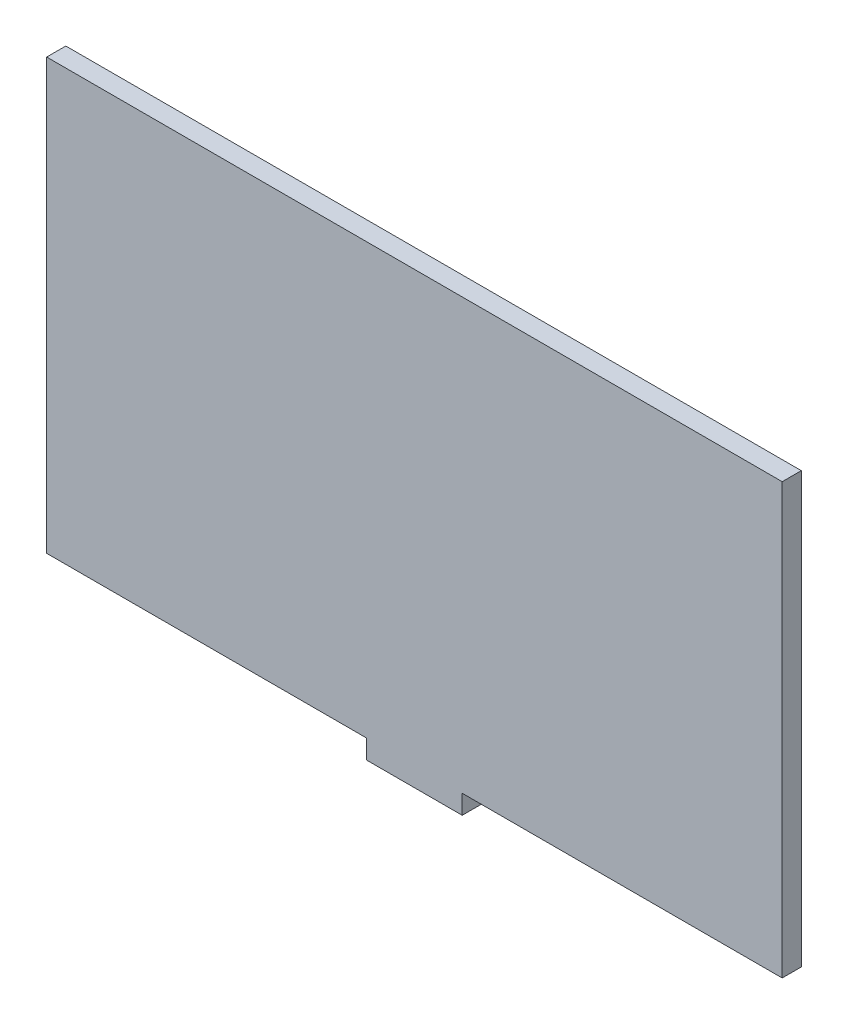
ISO-10303-21;
HEADER;
FILE_DESCRIPTION(('STEP AP214'),'2;1');
FILE_NAME('part.step','',(''),(''),'','','');
FILE_SCHEMA(('AUTOMOTIVE_DESIGN { 1 0 10303 214 1 1 1 1 }'));
ENDSEC;
DATA;
#1=APPLICATION_CONTEXT('core data for automotive mechanical design processes');
#2=APPLICATION_PROTOCOL_DEFINITION('international standard','automotive_design',2000,#1);
#3=PRODUCT_CONTEXT('',#1,'mechanical');
#4=PRODUCT('Part','Part','',(#3));
#5=PRODUCT_RELATED_PRODUCT_CATEGORY('part','',(#4));
#6=PRODUCT_DEFINITION_FORMATION('','',#4);
#7=PRODUCT_DEFINITION_CONTEXT('part definition',#1,'design');
#8=PRODUCT_DEFINITION('design','',#6,#7);
#9=PRODUCT_DEFINITION_SHAPE('','',#8);
#10=(LENGTH_UNIT() NAMED_UNIT(*) SI_UNIT(.MILLI.,.METRE.));
#11=(NAMED_UNIT(*) PLANE_ANGLE_UNIT() SI_UNIT($,.RADIAN.));
#12=(NAMED_UNIT(*) SI_UNIT($,.STERADIAN.) SOLID_ANGLE_UNIT());
#13=UNCERTAINTY_MEASURE_WITH_UNIT(LENGTH_MEASURE(1.E-05),#10,'distance_accuracy_value','');
#14=(GEOMETRIC_REPRESENTATION_CONTEXT(3) GLOBAL_UNCERTAINTY_ASSIGNED_CONTEXT((#13)) GLOBAL_UNIT_ASSIGNED_CONTEXT((#10,
#11,#12)) REPRESENTATION_CONTEXT('',''));
#15=CARTESIAN_POINT('',(0.,0.,0.));
#16=DIRECTION('',(0.,0.,1.));
#17=DIRECTION('',(1.,0.,0.));
#18=AXIS2_PLACEMENT_3D('',#15,#16,#17);
#19=CARTESIAN_POINT('',(-34.0534801136364,12.3013067045455,2.));
#20=DIRECTION('',(1.,0.,0.));
#21=DIRECTION('',(0.,0.,-1.));
#22=AXIS2_PLACEMENT_3D('',#19,#20,#21);
#23=PLANE('',#22);
#24=DIRECTION('',(0.,-1.,0.));
#25=VECTOR('',#24,1.);
#26=CARTESIAN_POINT('',(-34.0534801136364,12.3013067045455,0.));
#27=LINE('',#26,#25);
#28=CARTESIAN_POINT('',(-34.0534801136364,12.3013067045455,0.));
#29=VERTEX_POINT('',#28);
#30=CARTESIAN_POINT('',(-34.0534801136364,-32.6986932954546,0.));
#31=VERTEX_POINT('',#30);
#32=EDGE_CURVE('E135',#29,#31,#27,.T.);
#33=ORIENTED_EDGE('',*,*,#32,.T.);
#34=DIRECTION('',(0.,0.,-1.));
#35=VECTOR('',#34,1.);
#36=CARTESIAN_POINT('',(-34.0534801136364,-32.6986932954546,2.));
#37=LINE('',#36,#35);
#38=CARTESIAN_POINT('',(-34.0534801136364,-32.6986932954546,2.));
#39=VERTEX_POINT('',#38);
#40=EDGE_CURVE('E11',#39,#31,#37,.T.);
#41=ORIENTED_EDGE('',*,*,#40,.F.);
#42=DIRECTION('',(0.,-1.,0.));
#43=VECTOR('',#42,1.);
#44=CARTESIAN_POINT('',(-34.0534801136364,12.3013067045455,2.));
#45=LINE('',#44,#43);
#46=CARTESIAN_POINT('',(-34.0534801136364,12.3013067045455,2.));
#47=VERTEX_POINT('',#46);
#48=EDGE_CURVE('E149',#47,#39,#45,.T.);
#49=ORIENTED_EDGE('',*,*,#48,.F.);
#50=DIRECTION('',(0.,0.,-1.));
#51=VECTOR('',#50,1.);
#52=CARTESIAN_POINT('',(-34.0534801136364,12.3013067045455,2.));
#53=LINE('',#52,#51);
#54=EDGE_CURVE('E131',#47,#29,#53,.T.);
#55=ORIENTED_EDGE('',*,*,#54,.T.);
#56=EDGE_LOOP('',(#33,#41,#49,#55));
#57=FACE_BOUND('',#56,.T.);
#58=ADVANCED_FACE('F39',(#57),#23,.F.);
#59=CARTESIAN_POINT('',(-34.0534801136364,-32.6986932954546,2.));
#60=DIRECTION('',(0.,1.,0.));
#61=DIRECTION('',(-1.,0.,0.));
#62=AXIS2_PLACEMENT_3D('',#59,#60,#61);
#63=PLANE('',#62);
#64=DIRECTION('',(1.,0.,0.));
#65=VECTOR('',#64,1.);
#66=CARTESIAN_POINT('',(-34.0534801136364,-32.6986932954546,0.));
#67=LINE('',#66,#65);
#68=CARTESIAN_POINT('',(-0.553480113636365,-32.6986932954545,0.));
#69=VERTEX_POINT('',#68);
#70=EDGE_CURVE('E138',#31,#69,#67,.T.);
#71=ORIENTED_EDGE('',*,*,#70,.T.);
#72=DIRECTION('',(0.,0.,-1.));
#73=VECTOR('',#72,1.);
#74=CARTESIAN_POINT('',(-0.553480113636365,-32.6986932954545,2.));
#75=LINE('',#74,#73);
#76=CARTESIAN_POINT('',(-0.553480113636365,-32.6986932954545,2.));
#77=VERTEX_POINT('',#76);
#78=EDGE_CURVE('E47',#77,#69,#75,.T.);
#79=ORIENTED_EDGE('',*,*,#78,.F.);
#80=DIRECTION('',(1.,0.,0.));
#81=VECTOR('',#80,1.);
#82=CARTESIAN_POINT('',(-34.0534801136364,-32.6986932954546,2.));
#83=LINE('',#82,#81);
#84=EDGE_CURVE('E98',#39,#77,#83,.T.);
#85=ORIENTED_EDGE('',*,*,#84,.F.);
#86=ORIENTED_EDGE('',*,*,#40,.T.);
#87=EDGE_LOOP('',(#71,#79,#85,#86));
#88=FACE_BOUND('',#87,.T.);
#89=ADVANCED_FACE('F184',(#88),#63,.F.);
#90=CARTESIAN_POINT('',(-0.553480113636365,-34.6986932954545,2.));
#91=DIRECTION('',(1.,0.,0.));
#92=DIRECTION('',(0.,0.,-1.));
#93=AXIS2_PLACEMENT_3D('',#90,#91,#92);
#94=PLANE('',#93);
#95=DIRECTION('',(0.,-1.,0.));
#96=VECTOR('',#95,1.);
#97=CARTESIAN_POINT('',(-0.553480113636365,-34.6986932954545,0.));
#98=LINE('',#97,#96);
#99=CARTESIAN_POINT('',(-0.553480113636365,-34.6986932954545,0.));
#100=VERTEX_POINT('',#99);
#101=EDGE_CURVE('E140',#69,#100,#98,.T.);
#102=ORIENTED_EDGE('',*,*,#101,.T.);
#103=DIRECTION('',(0.,0.,-1.));
#104=VECTOR('',#103,1.);
#105=CARTESIAN_POINT('',(-0.553480113636365,-34.6986932954545,2.));
#106=LINE('',#105,#104);
#107=CARTESIAN_POINT('',(-0.553480113636365,-34.6986932954545,2.));
#108=VERTEX_POINT('',#107);
#109=EDGE_CURVE('E156',#108,#100,#106,.T.);
#110=ORIENTED_EDGE('',*,*,#109,.F.);
#111=DIRECTION('',(0.,-1.,0.));
#112=VECTOR('',#111,1.);
#113=CARTESIAN_POINT('',(-0.553480113636365,-34.6986932954545,2.));
#114=LINE('',#113,#112);
#115=EDGE_CURVE('E164',#77,#108,#114,.T.);
#116=ORIENTED_EDGE('',*,*,#115,.F.);
#117=ORIENTED_EDGE('',*,*,#78,.T.);
#118=EDGE_LOOP('',(#102,#110,#116,#117));
#119=FACE_BOUND('',#118,.T.);
#120=ADVANCED_FACE('F162',(#119),#94,.F.);
#121=CARTESIAN_POINT('',(-0.553480113636365,-34.6986932954545,2.));
#122=DIRECTION('',(0.,1.,0.));
#123=DIRECTION('',(0.,0.,1.));
#124=AXIS2_PLACEMENT_3D('',#121,#122,#123);
#125=PLANE('',#124);
#126=DIRECTION('',(1.,0.,0.));
#127=VECTOR('',#126,1.);
#128=CARTESIAN_POINT('',(-0.553480113636365,-34.6986932954545,0.));
#129=LINE('',#128,#127);
#130=CARTESIAN_POINT('',(9.44651988636364,-34.6986932954545,0.));
#131=VERTEX_POINT('',#130);
#132=EDGE_CURVE('E142',#100,#131,#129,.T.);
#133=ORIENTED_EDGE('',*,*,#132,.T.);
#134=DIRECTION('',(0.,0.,-1.));
#135=VECTOR('',#134,1.);
#136=CARTESIAN_POINT('',(9.44651988636364,-34.6986932954545,2.));
#137=LINE('',#136,#135);
#138=CARTESIAN_POINT('',(9.44651988636364,-34.6986932954545,2.));
#139=VERTEX_POINT('',#138);
#140=EDGE_CURVE('E153',#139,#131,#137,.T.);
#141=ORIENTED_EDGE('',*,*,#140,.F.);
#142=DIRECTION('',(1.,0.,0.));
#143=VECTOR('',#142,1.);
#144=CARTESIAN_POINT('',(-0.553480113636365,-34.6986932954545,2.));
#145=LINE('',#144,#143);
#146=EDGE_CURVE('E176',#108,#139,#145,.T.);
#147=ORIENTED_EDGE('',*,*,#146,.F.);
#148=ORIENTED_EDGE('',*,*,#109,.T.);
#149=EDGE_LOOP('',(#133,#141,#147,#148));
#150=FACE_BOUND('',#149,.T.);
#151=ADVANCED_FACE('F172',(#150),#125,.F.);
#152=CARTESIAN_POINT('',(9.44651988636364,-34.6986932954545,2.));
#153=DIRECTION('',(-1.,0.,0.));
#154=DIRECTION('',(0.,0.,1.));
#155=AXIS2_PLACEMENT_3D('',#152,#153,#154);
#156=PLANE('',#155);
#157=DIRECTION('',(0.,1.,0.));
#158=VECTOR('',#157,1.);
#159=CARTESIAN_POINT('',(9.44651988636364,-34.6986932954545,0.));
#160=LINE('',#159,#158);
#161=CARTESIAN_POINT('',(9.44651988636364,-32.6986932954545,0.));
#162=VERTEX_POINT('',#161);
#163=EDGE_CURVE('E144',#131,#162,#160,.T.);
#164=ORIENTED_EDGE('',*,*,#163,.T.);
#165=DIRECTION('',(0.,0.,-1.));
#166=VECTOR('',#165,1.);
#167=CARTESIAN_POINT('',(9.44651988636364,-32.6986932954545,2.));
#168=LINE('',#167,#166);
#169=CARTESIAN_POINT('',(9.44651988636364,-32.6986932954545,2.));
#170=VERTEX_POINT('',#169);
#171=EDGE_CURVE('E126',#170,#162,#168,.T.);
#172=ORIENTED_EDGE('',*,*,#171,.F.);
#173=DIRECTION('',(0.,1.,0.));
#174=VECTOR('',#173,1.);
#175=CARTESIAN_POINT('',(9.44651988636364,-34.6986932954545,2.));
#176=LINE('',#175,#174);
#177=EDGE_CURVE('E117',#139,#170,#176,.T.);
#178=ORIENTED_EDGE('',*,*,#177,.F.);
#179=ORIENTED_EDGE('',*,*,#140,.T.);
#180=EDGE_LOOP('',(#164,#172,#178,#179));
#181=FACE_BOUND('',#180,.T.);
#182=ADVANCED_FACE('F175',(#181),#156,.F.);
#183=CARTESIAN_POINT('',(9.44651988636364,-32.6986932954545,2.));
#184=DIRECTION('',(0.,1.,0.));
#185=DIRECTION('',(0.,0.,1.));
#186=AXIS2_PLACEMENT_3D('',#183,#184,#185);
#187=PLANE('',#186);
#188=DIRECTION('',(1.,0.,0.));
#189=VECTOR('',#188,1.);
#190=CARTESIAN_POINT('',(9.44651988636364,-32.6986932954545,0.));
#191=LINE('',#190,#189);
#192=CARTESIAN_POINT('',(42.9465198863636,-32.6986932954545,0.));
#193=VERTEX_POINT('',#192);
#194=EDGE_CURVE('E125',#162,#193,#191,.T.);
#195=ORIENTED_EDGE('',*,*,#194,.T.);
#196=DIRECTION('',(0.,0.,-1.));
#197=VECTOR('',#196,1.);
#198=CARTESIAN_POINT('',(42.9465198863636,-32.6986932954545,2.));
#199=LINE('',#198,#197);
#200=CARTESIAN_POINT('',(42.9465198863636,-32.6986932954545,2.));
#201=VERTEX_POINT('',#200);
#202=EDGE_CURVE('E122',#201,#193,#199,.T.);
#203=ORIENTED_EDGE('',*,*,#202,.F.);
#204=DIRECTION('',(1.,0.,0.));
#205=VECTOR('',#204,1.);
#206=CARTESIAN_POINT('',(9.44651988636364,-32.6986932954545,2.));
#207=LINE('',#206,#205);
#208=EDGE_CURVE('E111',#170,#201,#207,.T.);
#209=ORIENTED_EDGE('',*,*,#208,.F.);
#210=ORIENTED_EDGE('',*,*,#171,.T.);
#211=EDGE_LOOP('',(#195,#203,#209,#210));
#212=FACE_BOUND('',#211,.T.);
#213=ADVANCED_FACE('F123',(#212),#187,.F.);
#214=CARTESIAN_POINT('',(42.9465198863636,12.3013067045455,2.));
#215=DIRECTION('',(-1.,0.,0.));
#216=DIRECTION('',(0.,-1.,0.));
#217=AXIS2_PLACEMENT_3D('',#214,#215,#216);
#218=PLANE('',#217);
#219=DIRECTION('',(0.,1.,0.));
#220=VECTOR('',#219,1.);
#221=CARTESIAN_POINT('',(42.9465198863636,12.3013067045455,0.));
#222=LINE('',#221,#220);
#223=CARTESIAN_POINT('',(42.9465198863636,12.3013067045455,0.));
#224=VERTEX_POINT('',#223);
#225=EDGE_CURVE('E84',#193,#224,#222,.T.);
#226=ORIENTED_EDGE('',*,*,#225,.T.);
#227=DIRECTION('',(0.,0.,-1.));
#228=VECTOR('',#227,1.);
#229=CARTESIAN_POINT('',(42.9465198863636,12.3013067045455,2.));
#230=LINE('',#229,#228);
#231=CARTESIAN_POINT('',(42.9465198863636,12.3013067045455,2.));
#232=VERTEX_POINT('',#231);
#233=EDGE_CURVE('E127',#232,#224,#230,.T.);
#234=ORIENTED_EDGE('',*,*,#233,.F.);
#235=DIRECTION('',(0.,1.,0.));
#236=VECTOR('',#235,1.);
#237=CARTESIAN_POINT('',(42.9465198863636,12.3013067045455,2.));
#238=LINE('',#237,#236);
#239=EDGE_CURVE('E115',#201,#232,#238,.T.);
#240=ORIENTED_EDGE('',*,*,#239,.F.);
#241=ORIENTED_EDGE('',*,*,#202,.T.);
#242=EDGE_LOOP('',(#226,#234,#240,#241));
#243=FACE_BOUND('',#242,.T.);
#244=ADVANCED_FACE('F129',(#243),#218,.F.);
#245=CARTESIAN_POINT('',(-34.0534801136364,12.3013067045455,2.));
#246=DIRECTION('',(0.,-1.,0.));
#247=DIRECTION('',(1.,0.,0.));
#248=AXIS2_PLACEMENT_3D('',#245,#246,#247);
#249=PLANE('',#248);
#250=DIRECTION('',(-1.,0.,0.));
#251=VECTOR('',#250,1.);
#252=CARTESIAN_POINT('',(-34.0534801136364,12.3013067045455,0.));
#253=LINE('',#252,#251);
#254=EDGE_CURVE('E90',#224,#29,#253,.T.);
#255=ORIENTED_EDGE('',*,*,#254,.T.);
#256=ORIENTED_EDGE('',*,*,#54,.F.);
#257=DIRECTION('',(-1.,0.,0.));
#258=VECTOR('',#257,1.);
#259=CARTESIAN_POINT('',(-34.0534801136364,12.3013067045455,2.));
#260=LINE('',#259,#258);
#261=EDGE_CURVE('E55',#232,#47,#260,.T.);
#262=ORIENTED_EDGE('',*,*,#261,.F.);
#263=ORIENTED_EDGE('',*,*,#233,.T.);
#264=EDGE_LOOP('',(#255,#256,#262,#263));
#265=FACE_BOUND('',#264,.T.);
#266=ADVANCED_FACE('F200',(#265),#249,.F.);
#267=CARTESIAN_POINT('',(0.,0.,2.));
#268=DIRECTION('',(0.,0.,1.));
#269=DIRECTION('',(1.,0.,0.));
#270=AXIS2_PLACEMENT_3D('',#267,#268,#269);
#271=PLANE('',#270);
#272=ORIENTED_EDGE('',*,*,#48,.T.);
#273=ORIENTED_EDGE('',*,*,#84,.T.);
#274=ORIENTED_EDGE('',*,*,#115,.T.);
#275=ORIENTED_EDGE('',*,*,#146,.T.);
#276=ORIENTED_EDGE('',*,*,#177,.T.);
#277=ORIENTED_EDGE('',*,*,#208,.T.);
#278=ORIENTED_EDGE('',*,*,#239,.T.);
#279=ORIENTED_EDGE('',*,*,#261,.T.);
#280=EDGE_LOOP('',(#272,#273,#274,#275,#276,#277,#278,#279));
#281=FACE_BOUND('',#280,.T.);
#282=ADVANCED_FACE('F113',(#281),#271,.T.);
#283=CARTESIAN_POINT('',(0.,0.,0.));
#284=DIRECTION('',(0.,0.,1.));
#285=DIRECTION('',(1.,0.,0.));
#286=AXIS2_PLACEMENT_3D('',#283,#284,#285);
#287=PLANE('',#286);
#288=ORIENTED_EDGE('',*,*,#32,.F.);
#289=ORIENTED_EDGE('',*,*,#254,.F.);
#290=ORIENTED_EDGE('',*,*,#225,.F.);
#291=ORIENTED_EDGE('',*,*,#194,.F.);
#292=ORIENTED_EDGE('',*,*,#163,.F.);
#293=ORIENTED_EDGE('',*,*,#132,.F.);
#294=ORIENTED_EDGE('',*,*,#101,.F.);
#295=ORIENTED_EDGE('',*,*,#70,.F.);
#296=EDGE_LOOP('',(#288,#289,#290,#291,#292,#293,#294,#295));
#297=FACE_BOUND('',#296,.T.);
#298=ADVANCED_FACE('F168',(#297),#287,.F.);
#299=CLOSED_SHELL('',(#58,#89,#120,#151,#182,#213,#244,#266,#282,#298));
#300=MANIFOLD_SOLID_BREP('B2',#299);
#301=ADVANCED_BREP_SHAPE_REPRESENTATION('',(#18,#300),#14);
#302=SHAPE_DEFINITION_REPRESENTATION(#9,#301);
ENDSEC;
END-ISO-10303-21;
